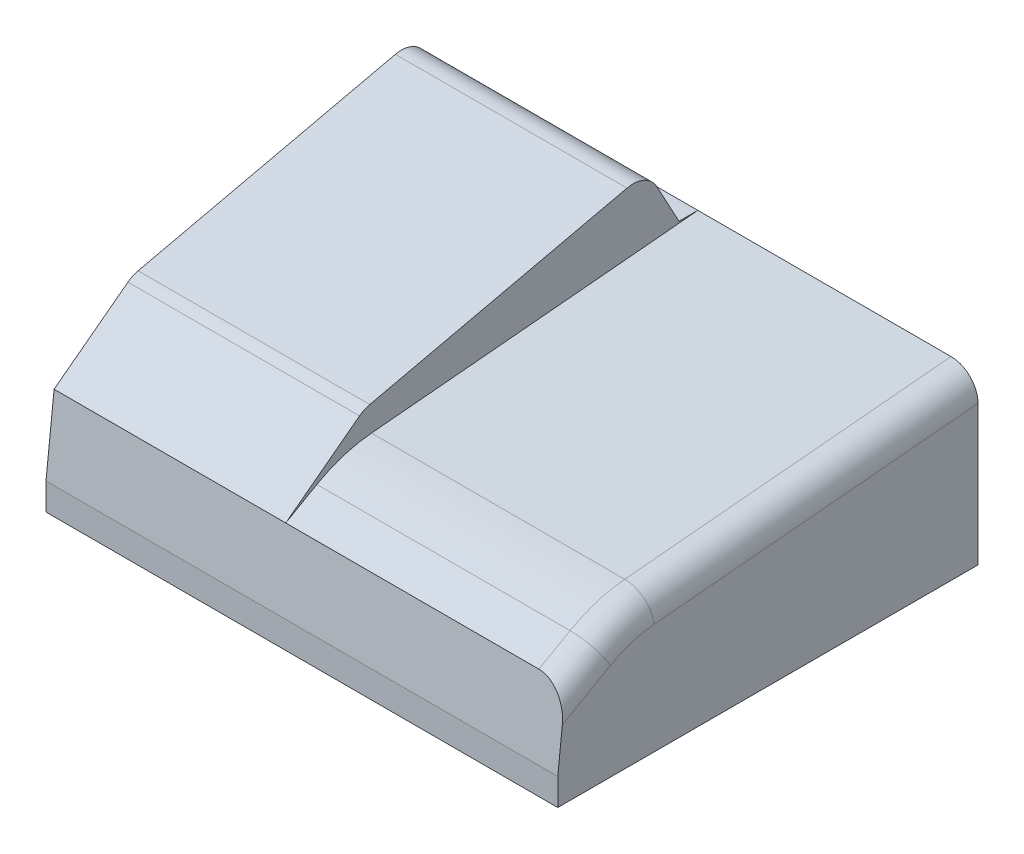
ISO-10303-21;
HEADER;
FILE_DESCRIPTION(('STEP AP214'),'2;1');
FILE_NAME('part.step','',(''),(''),'','','');
FILE_SCHEMA(('AUTOMOTIVE_DESIGN { 1 0 10303 214 1 1 1 1 }'));
ENDSEC;
DATA;
#1=APPLICATION_CONTEXT('core data for automotive mechanical design processes');
#2=APPLICATION_PROTOCOL_DEFINITION('international standard','automotive_design',2000,#1);
#3=PRODUCT_CONTEXT('',#1,'mechanical');
#4=PRODUCT('Part','Part','',(#3));
#5=PRODUCT_RELATED_PRODUCT_CATEGORY('part','',(#4));
#6=PRODUCT_DEFINITION_FORMATION('','',#4);
#7=PRODUCT_DEFINITION_CONTEXT('part definition',#1,'design');
#8=PRODUCT_DEFINITION('design','',#6,#7);
#9=PRODUCT_DEFINITION_SHAPE('','',#8);
#10=(LENGTH_UNIT() NAMED_UNIT(*) SI_UNIT(.MILLI.,.METRE.));
#11=(NAMED_UNIT(*) PLANE_ANGLE_UNIT() SI_UNIT($,.RADIAN.));
#12=(NAMED_UNIT(*) SI_UNIT($,.STERADIAN.) SOLID_ANGLE_UNIT());
#13=UNCERTAINTY_MEASURE_WITH_UNIT(LENGTH_MEASURE(1.E-05),#10,'distance_accuracy_value','');
#14=(GEOMETRIC_REPRESENTATION_CONTEXT(3) GLOBAL_UNCERTAINTY_ASSIGNED_CONTEXT((#13)) GLOBAL_UNIT_ASSIGNED_CONTEXT((#10,
#11,#12)) REPRESENTATION_CONTEXT('',''));
#15=CARTESIAN_POINT('',(0.,0.,0.));
#16=DIRECTION('',(0.,0.,1.));
#17=DIRECTION('',(1.,0.,0.));
#18=AXIS2_PLACEMENT_3D('',#15,#16,#17);
#19=CARTESIAN_POINT('',(95.,84.,78.));
#20=DIRECTION('',(-1.,0.,0.));
#21=DIRECTION('',(0.,0.,1.));
#22=AXIS2_PLACEMENT_3D('',#19,#20,#21);
#23=PLANE('',#22);
#24=CARTESIAN_POINT('',(95.,1.19028875614798,38.6387728230092));
#25=DIRECTION('',(-1.,0.,0.));
#26=DIRECTION('',(0.,0.,1.));
#27=AXIS2_PLACEMENT_3D('',#24,#25,#26);
#28=CIRCLE('',#27,40.);
#29=CARTESIAN_POINT('',(95.,41.0260170148562,42.2602026647099));
#30=VERTEX_POINT('',#29);
#31=CARTESIAN_POINT('',(95.,35.9200144411263,58.4843303572825));
#32=VERTEX_POINT('',#31);
#33=EDGE_CURVE('E277',#30,#32,#28,.F.);
#34=ORIENTED_EDGE('',*,*,#33,.T.);
#35=DIRECTION('',(0.,-0.496138938356834,0.868243142124459));
#36=VECTOR('',#35,1.);
#37=CARTESIAN_POINT('',(95.,29.3175685787554,70.0386106164317));
#38=LINE('',#37,#36);
#39=CARTESIAN_POINT('',(95.,25.7313469047631,76.3144985459183));
#40=VERTEX_POINT('',#39);
#41=EDGE_CURVE('E280',#32,#40,#38,.T.);
#42=ORIENTED_EDGE('',*,*,#41,.T.);
#43=DIRECTION('',(0.,-0.994309153919809,0.106533123634265));
#44=VECTOR('',#43,1.);
#45=CARTESIAN_POINT('',(95.,8.37578814627996,78.1740226986129));
#46=LINE('',#45,#44);
#47=CARTESIAN_POINT('',(95.,10.,78.));
#48=VERTEX_POINT('',#47);
#49=EDGE_CURVE('E334',#40,#48,#46,.T.);
#50=ORIENTED_EDGE('',*,*,#49,.T.);
#51=DIRECTION('',(0.,-1.,0.));
#52=VECTOR('',#51,1.);
#53=CARTESIAN_POINT('',(95.,84.,78.));
#54=LINE('',#53,#52);
#55=CARTESIAN_POINT('',(95.,0.,78.));
#56=VERTEX_POINT('',#55);
#57=EDGE_CURVE('E242',#48,#56,#54,.T.);
#58=ORIENTED_EDGE('',*,*,#57,.T.);
#59=DIRECTION('',(0.,0.,-1.));
#60=VECTOR('',#59,1.);
#61=CARTESIAN_POINT('',(95.,0.,78.));
#62=LINE('',#61,#60);
#63=CARTESIAN_POINT('',(95.,0.,-78.));
#64=VERTEX_POINT('',#63);
#65=EDGE_CURVE('E193',#56,#64,#62,.T.);
#66=ORIENTED_EDGE('',*,*,#65,.T.);
#67=DIRECTION('',(0.,-1.,0.));
#68=VECTOR('',#67,1.);
#69=CARTESIAN_POINT('',(95.,84.,-78.));
#70=LINE('',#69,#68);
#71=CARTESIAN_POINT('',(95.,51.958762711648,-78.));
#72=VERTEX_POINT('',#71);
#73=EDGE_CURVE('E250',#72,#64,#70,.T.);
#74=ORIENTED_EDGE('',*,*,#73,.F.);
#75=DIRECTION('',(0.,-0.0905357460425184,0.995893206467704));
#76=VECTOR('',#75,1.);
#77=CARTESIAN_POINT('',(95.,41.0260170148562,42.2602026647099));
#78=LINE('',#77,#76);
#79=EDGE_CURVE('E274',#72,#30,#78,.T.);
#80=ORIENTED_EDGE('',*,*,#79,.T.);
#81=EDGE_LOOP('',(#34,#42,#50,#58,#66,#74,#80));
#82=FACE_BOUND('',#81,.T.);
#83=ADVANCED_FACE('F71',(#82),#23,.F.);
#84=CARTESIAN_POINT('',(95.,62.,0.));
#85=DIRECTION('',(0.,-1.,0.));
#86=DIRECTION('',(0.,0.,-1.));
#87=AXIS2_PLACEMENT_3D('',#84,#85,#86);
#88=PLANE('',#87);
#89=DIRECTION('',(0.,0.,1.));
#90=VECTOR('',#89,1.);
#91=CARTESIAN_POINT('',(-9.00000000000001,62.,0.));
#92=LINE('',#91,#90);
#93=CARTESIAN_POINT('',(-9.00000000000001,62.,-78.));
#94=VERTEX_POINT('',#93);
#95=CARTESIAN_POINT('',(-9.00000000000001,62.,-71.));
#96=VERTEX_POINT('',#95);
#97=EDGE_CURVE('E200',#94,#96,#92,.T.);
#98=ORIENTED_EDGE('',*,*,#97,.F.);
#99=DIRECTION('',(-1.,0.,0.));
#100=VECTOR('',#99,1.);
#101=CARTESIAN_POINT('',(95.,62.,-78.));
#102=LINE('',#101,#100);
#103=CARTESIAN_POINT('',(-95.,62.,-78.));
#104=VERTEX_POINT('',#103);
#105=EDGE_CURVE('E194',#94,#104,#102,.T.);
#106=ORIENTED_EDGE('',*,*,#105,.T.);
#107=DIRECTION('',(0.,0.,1.));
#108=VECTOR('',#107,1.);
#109=CARTESIAN_POINT('',(-95.,62.,0.));
#110=LINE('',#109,#108);
#111=CARTESIAN_POINT('',(-95.,62.,-71.));
#112=VERTEX_POINT('',#111);
#113=EDGE_CURVE('E350',#104,#112,#110,.T.);
#114=ORIENTED_EDGE('',*,*,#113,.T.);
#115=DIRECTION('',(-1.,0.,0.));
#116=VECTOR('',#115,1.);
#117=CARTESIAN_POINT('',(95.,62.,-71.));
#118=LINE('',#117,#116);
#119=EDGE_CURVE('E213',#96,#112,#118,.T.);
#120=ORIENTED_EDGE('',*,*,#119,.F.);
#121=EDGE_LOOP('',(#98,#106,#114,#120));
#122=FACE_BOUND('',#121,.T.);
#123=ADVANCED_FACE('F210',(#122),#88,.F.);
#124=CARTESIAN_POINT('',(95.,43.6861619273724,-80.8906520723429));
#125=DIRECTION('',(0.,-0.475192789399669,0.879881703925341));
#126=DIRECTION('',(0.,-0.879881703925341,-0.475192789399669));
#127=AXIS2_PLACEMENT_3D('',#124,#125,#126);
#128=PLANE('',#127);
#129=DIRECTION('',(0.,0.879881703925341,0.475192789399669));
#130=VECTOR('',#129,1.);
#131=CARTESIAN_POINT('',(-95.,43.6861619273724,-80.8906520723429));
#132=LINE('',#131,#130);
#133=CARTESIAN_POINT('',(-95.,77.3088485792152,-62.7322357921518));
#134=VERTEX_POINT('',#133);
#135=EDGE_CURVE('E223',#112,#134,#132,.T.);
#136=ORIENTED_EDGE('',*,*,#135,.T.);
#137=DIRECTION('',(-1.,0.,0.));
#138=VECTOR('',#137,1.);
#139=CARTESIAN_POINT('',(95.,77.3088485792151,-62.7322357921518));
#140=LINE('',#139,#138);
#141=CARTESIAN_POINT('',(-9.00000000000001,77.3088485792152,-62.7322357921518));
#142=VERTEX_POINT('',#141);
#143=EDGE_CURVE('E268',#134,#142,#140,.F.);
#144=ORIENTED_EDGE('',*,*,#143,.T.);
#145=DIRECTION('',(0.,0.879881703925341,0.475192789399669));
#146=VECTOR('',#145,1.);
#147=CARTESIAN_POINT('',(-9.00000000000001,43.6861619273724,-80.8906520723429));
#148=LINE('',#147,#146);
#149=EDGE_CURVE('E215',#96,#142,#148,.T.);
#150=ORIENTED_EDGE('',*,*,#149,.F.);
#151=ORIENTED_EDGE('',*,*,#119,.T.);
#152=EDGE_LOOP('',(#136,#144,#150,#151));
#153=FACE_BOUND('',#152,.T.);
#154=ADVANCED_FACE('F360',(#153),#128,.F.);
#155=CARTESIAN_POINT('',(95.,60.264316280733,45.5315753052334));
#156=DIRECTION('',(0.,-0.797876644434083,-0.602820753015859));
#157=DIRECTION('',(0.,0.602820753015859,-0.797876644434083));
#158=AXIS2_PLACEMENT_3D('',#155,#156,#157);
#159=PLANE('',#158);
#160=DIRECTION('',(0.,-0.602820753015859,0.797876644434083));
#161=VECTOR('',#160,1.);
#162=CARTESIAN_POINT('',(-9.00000000000001,60.264316280733,45.5315753052334));
#163=LINE('',#162,#161);
#164=CARTESIAN_POINT('',(-9.00000000000001,58.7078191262554,47.5917112917149));
#165=VERTEX_POINT('',#164);
#166=CARTESIAN_POINT('',(-9.00000000000001,38.,75.));
#167=VERTEX_POINT('',#166);
#168=EDGE_CURVE('E330',#165,#167,#163,.T.);
#169=ORIENTED_EDGE('',*,*,#168,.F.);
#170=DIRECTION('',(-1.,0.,0.));
#171=VECTOR('',#170,1.);
#172=CARTESIAN_POINT('',(95.,58.7078191262553,47.5917112917149));
#173=LINE('',#172,#171);
#174=CARTESIAN_POINT('',(-95.,58.7078191262553,47.5917112917149));
#175=VERTEX_POINT('',#174);
#176=EDGE_CURVE('E298',#165,#175,#173,.T.);
#177=ORIENTED_EDGE('',*,*,#176,.T.);
#178=DIRECTION('',(0.,-0.60282075301586,0.797876644434083));
#179=VECTOR('',#178,1.);
#180=CARTESIAN_POINT('',(-95.,60.264316280733,45.5315753052334));
#181=LINE('',#180,#179);
#182=CARTESIAN_POINT('',(-95.,38.,75.));
#183=VERTEX_POINT('',#182);
#184=EDGE_CURVE('E333',#175,#183,#181,.T.);
#185=ORIENTED_EDGE('',*,*,#184,.T.);
#186=DIRECTION('',(-1.,0.,0.));
#187=VECTOR('',#186,1.);
#188=CARTESIAN_POINT('',(95.,38.,75.));
#189=LINE('',#188,#187);
#190=EDGE_CURVE('E337',#167,#183,#189,.T.);
#191=ORIENTED_EDGE('',*,*,#190,.F.);
#192=EDGE_LOOP('',(#169,#177,#185,#191));
#193=FACE_BOUND('',#192,.T.);
#194=ADVANCED_FACE('F424',(#193),#159,.F.);
#195=CARTESIAN_POINT('',(95.,66.9874295875038,15.3114124771437));
#196=DIRECTION('',(0.,-0.974858506571867,-0.222824801502141));
#197=DIRECTION('',(0.,0.222824801502141,-0.974858506571867));
#198=AXIS2_PLACEMENT_3D('',#195,#196,#197);
#199=PLANE('',#198);
#200=DIRECTION('',(0.,-0.222824801502141,0.974858506571867));
#201=VECTOR('',#200,1.);
#202=CARTESIAN_POINT('',(-95.,66.9874295875038,15.3114124771437));
#203=LINE('',#202,#201);
#204=CARTESIAN_POINT('',(-95.,82.3055057509371,-51.705170737877));
#205=VERTEX_POINT('',#204);
#206=CARTESIAN_POINT('',(-95.,60.4776377476332,43.7917517765777));
#207=VERTEX_POINT('',#206);
#208=EDGE_CURVE('E338',#205,#207,#203,.T.);
#209=ORIENTED_EDGE('',*,*,#208,.T.);
#210=DIRECTION('',(-1.,0.,0.));
#211=VECTOR('',#210,1.);
#212=CARTESIAN_POINT('',(95.,60.4776377476332,43.7917517765777));
#213=LINE('',#212,#211);
#214=CARTESIAN_POINT('',(-9.00000000000001,60.4776377476332,43.7917517765777));
#215=VERTEX_POINT('',#214);
#216=EDGE_CURVE('E81',#207,#215,#213,.F.);
#217=ORIENTED_EDGE('',*,*,#216,.T.);
#218=DIRECTION('',(0.,-0.222824801502141,0.974858506571867));
#219=VECTOR('',#218,1.);
#220=CARTESIAN_POINT('',(-9.00000000000001,66.9874295875038,15.3114124771437));
#221=LINE('',#220,#219);
#222=CARTESIAN_POINT('',(-9.00000000000001,82.3055057509371,-51.705170737877));
#223=VERTEX_POINT('',#222);
#224=EDGE_CURVE('E327',#223,#215,#221,.T.);
#225=ORIENTED_EDGE('',*,*,#224,.F.);
#226=DIRECTION('',(-1.,0.,0.));
#227=VECTOR('',#226,1.);
#228=CARTESIAN_POINT('',(95.,82.3055057509371,-51.705170737877));
#229=LINE('',#228,#227);
#230=EDGE_CURVE('E261',#223,#205,#229,.T.);
#231=ORIENTED_EDGE('',*,*,#230,.T.);
#232=EDGE_LOOP('',(#209,#217,#225,#231));
#233=FACE_BOUND('',#232,.T.);
#234=ADVANCED_FACE('F366',(#233),#199,.F.);
#235=CARTESIAN_POINT('',(-95.,84.,-78.));
#236=DIRECTION('',(0.,0.,1.));
#237=DIRECTION('',(1.,0.,0.));
#238=AXIS2_PLACEMENT_3D('',#235,#236,#237);
#239=PLANE('',#238);
#240=CARTESIAN_POINT('',(85.,62.,-78.));
#241=VERTEX_POINT('',#240);
#242=EDGE_CURVE('E181',#241,#94,#102,.T.);
#243=ORIENTED_EDGE('',*,*,#242,.F.);
#244=CARTESIAN_POINT('',(85.,51.9587627116479,-78.));
#245=DIRECTION('',(0.,0.,1.));
#246=DIRECTION('',(0.,1.,0.));
#247=AXIS2_PLACEMENT_3D('',#244,#245,#246);
#248=ELLIPSE('',#247,10.0412372883521,10.);
#249=EDGE_CURVE('E295',#241,#72,#248,.F.);
#250=ORIENTED_EDGE('',*,*,#249,.T.);
#251=ORIENTED_EDGE('',*,*,#73,.T.);
#252=DIRECTION('',(-1.,0.,0.));
#253=VECTOR('',#252,1.);
#254=CARTESIAN_POINT('',(-95.,0.,-78.));
#255=LINE('',#254,#253);
#256=CARTESIAN_POINT('',(-95.,0.,-78.));
#257=VERTEX_POINT('',#256);
#258=EDGE_CURVE('E231',#64,#257,#255,.T.);
#259=ORIENTED_EDGE('',*,*,#258,.T.);
#260=DIRECTION('',(0.,-1.,0.));
#261=VECTOR('',#260,1.);
#262=CARTESIAN_POINT('',(-95.,84.,-78.));
#263=LINE('',#262,#261);
#264=EDGE_CURVE('E220',#104,#257,#263,.T.);
#265=ORIENTED_EDGE('',*,*,#264,.F.);
#266=ORIENTED_EDGE('',*,*,#105,.F.);
#267=EDGE_LOOP('',(#243,#250,#251,#259,#265,#266));
#268=FACE_BOUND('',#267,.T.);
#269=ADVANCED_FACE('F218',(#268),#239,.F.);
#270=CARTESIAN_POINT('',(-95.,84.,78.));
#271=DIRECTION('',(1.,0.,0.));
#272=DIRECTION('',(0.,0.,-1.));
#273=AXIS2_PLACEMENT_3D('',#270,#271,#272);
#274=PLANE('',#273);
#275=ORIENTED_EDGE('',*,*,#184,.F.);
#276=CARTESIAN_POINT('',(-95.,50.7290526819145,41.5635037615563));
#277=DIRECTION('',(1.,0.,0.));
#278=DIRECTION('',(0.,0.,-1.));
#279=AXIS2_PLACEMENT_3D('',#276,#277,#278);
#280=CIRCLE('',#279,10.);
#281=EDGE_CURVE('E96',#175,#207,#280,.F.);
#282=ORIENTED_EDGE('',*,*,#281,.T.);
#283=ORIENTED_EDGE('',*,*,#208,.F.);
#284=CARTESIAN_POINT('',(-95.,72.5569206852184,-53.9334187528984));
#285=DIRECTION('',(1.,0.,0.));
#286=DIRECTION('',(0.,0.,-1.));
#287=AXIS2_PLACEMENT_3D('',#284,#285,#286);
#288=CIRCLE('',#287,10.);
#289=EDGE_CURVE('E265',#205,#134,#288,.F.);
#290=ORIENTED_EDGE('',*,*,#289,.T.);
#291=ORIENTED_EDGE('',*,*,#135,.F.);
#292=ORIENTED_EDGE('',*,*,#113,.F.);
#293=ORIENTED_EDGE('',*,*,#264,.T.);
#294=DIRECTION('',(0.,0.,1.));
#295=VECTOR('',#294,1.);
#296=CARTESIAN_POINT('',(-95.,0.,78.));
#297=LINE('',#296,#295);
#298=CARTESIAN_POINT('',(-95.,0.,78.));
#299=VERTEX_POINT('',#298);
#300=EDGE_CURVE('E234',#257,#299,#297,.T.);
#301=ORIENTED_EDGE('',*,*,#300,.T.);
#302=DIRECTION('',(0.,-1.,0.));
#303=VECTOR('',#302,1.);
#304=CARTESIAN_POINT('',(-95.,84.,78.));
#305=LINE('',#304,#303);
#306=CARTESIAN_POINT('',(-95.,10.,78.));
#307=VERTEX_POINT('',#306);
#308=EDGE_CURVE('E245',#307,#299,#305,.T.);
#309=ORIENTED_EDGE('',*,*,#308,.F.);
#310=DIRECTION('',(0.,-0.994309153919809,0.106533123634265));
#311=VECTOR('',#310,1.);
#312=CARTESIAN_POINT('',(-95.,8.37578814627996,78.1740226986129));
#313=LINE('',#312,#311);
#314=EDGE_CURVE('E341',#183,#307,#313,.T.);
#315=ORIENTED_EDGE('',*,*,#314,.F.);
#316=EDGE_LOOP('',(#275,#282,#283,#290,#291,#292,#293,#301,#309,#315));
#317=FACE_BOUND('',#316,.T.);
#318=ADVANCED_FACE('F367',(#317),#274,.F.);
#319=CARTESIAN_POINT('',(-95.,84.,78.));
#320=DIRECTION('',(0.,0.,-1.));
#321=DIRECTION('',(-1.,0.,0.));
#322=AXIS2_PLACEMENT_3D('',#319,#320,#321);
#323=PLANE('',#322);
#324=ORIENTED_EDGE('',*,*,#57,.F.);
#325=DIRECTION('',(-1.,0.,0.));
#326=VECTOR('',#325,1.);
#327=CARTESIAN_POINT('',(95.,10.,78.));
#328=LINE('',#327,#326);
#329=EDGE_CURVE('E346',#48,#307,#328,.T.);
#330=ORIENTED_EDGE('',*,*,#329,.T.);
#331=ORIENTED_EDGE('',*,*,#308,.T.);
#332=DIRECTION('',(1.,0.,0.));
#333=VECTOR('',#332,1.);
#334=CARTESIAN_POINT('',(-95.,0.,78.));
#335=LINE('',#334,#333);
#336=EDGE_CURVE('E238',#299,#56,#335,.T.);
#337=ORIENTED_EDGE('',*,*,#336,.T.);
#338=EDGE_LOOP('',(#324,#330,#331,#337));
#339=FACE_BOUND('',#338,.T.);
#340=ADVANCED_FACE('F370',(#339),#323,.F.);
#341=CARTESIAN_POINT('',(0.,0.,0.));
#342=DIRECTION('',(0.,-1.,0.));
#343=DIRECTION('',(0.,0.,-1.));
#344=AXIS2_PLACEMENT_3D('',#341,#342,#343);
#345=PLANE('',#344);
#346=ORIENTED_EDGE('',*,*,#65,.F.);
#347=ORIENTED_EDGE('',*,*,#336,.F.);
#348=ORIENTED_EDGE('',*,*,#300,.F.);
#349=ORIENTED_EDGE('',*,*,#258,.F.);
#350=EDGE_LOOP('',(#346,#347,#348,#349));
#351=FACE_BOUND('',#350,.T.);
#352=ADVANCED_FACE('F377',(#351),#345,.T.);
#353=CARTESIAN_POINT('',(95.,8.37578814627996,78.1740226986129));
#354=DIRECTION('',(0.,-0.106533123634265,-0.994309153919809));
#355=DIRECTION('',(0.,0.994309153919809,-0.106533123634265));
#356=AXIS2_PLACEMENT_3D('',#353,#354,#355);
#357=PLANE('',#356);
#358=ORIENTED_EDGE('',*,*,#49,.F.);
#359=CARTESIAN_POINT('',(85.,25.7313469047631,76.3144985459183));
#360=DIRECTION('',(0.,-0.106533123634265,-0.994309153919809));
#361=DIRECTION('',(0.,0.994309153919809,-0.106533123634265));
#362=AXIS2_PLACEMENT_3D('',#359,#360,#361);
#363=ELLIPSE('',#362,12.33887171497,10.);
#364=CARTESIAN_POINT('',(85.,38.,75.));
#365=VERTEX_POINT('',#364);
#366=EDGE_CURVE('E284',#40,#365,#363,.F.);
#367=ORIENTED_EDGE('',*,*,#366,.T.);
#368=EDGE_CURVE('E351',#365,#167,#189,.T.);
#369=ORIENTED_EDGE('',*,*,#368,.T.);
#370=ORIENTED_EDGE('',*,*,#190,.T.);
#371=ORIENTED_EDGE('',*,*,#314,.T.);
#372=ORIENTED_EDGE('',*,*,#329,.F.);
#373=EDGE_LOOP('',(#358,#367,#369,#370,#371,#372));
#374=FACE_BOUND('',#373,.T.);
#375=ADVANCED_FACE('F419',(#374),#357,.F.);
#376=CARTESIAN_POINT('',(-9.00000000000001,60.9538461538462,34.8307692307692));
#377=DIRECTION('',(0.,0.868243142124459,0.496138938356834));
#378=DIRECTION('',(0.,-0.496138938356834,0.868243142124459));
#379=AXIS2_PLACEMENT_3D('',#376,#377,#378);
#380=PLANE('',#379);
#381=ORIENTED_EDGE('',*,*,#368,.F.);
#382=DIRECTION('',(0.,-0.496138938356834,0.868243142124459));
#383=VECTOR('',#382,1.);
#384=CARTESIAN_POINT('',(85.,44.6024458623709,63.4457197408509));
#385=LINE('',#384,#383);
#386=CARTESIAN_POINT('',(85.,44.6024458623709,63.4457197408509));
#387=VERTEX_POINT('',#386);
#388=EDGE_CURVE('E287',#365,#387,#385,.F.);
#389=ORIENTED_EDGE('',*,*,#388,.T.);
#390=DIRECTION('',(1.,0.,0.));
#391=VECTOR('',#390,1.);
#392=CARTESIAN_POINT('',(-9.00000000000001,44.6024458623709,63.4457197408509));
#393=LINE('',#392,#391);
#394=CARTESIAN_POINT('',(-9.00000000000001,44.6024458623709,63.4457197408509));
#395=VERTEX_POINT('',#394);
#396=EDGE_CURVE('E256',#387,#395,#393,.F.);
#397=ORIENTED_EDGE('',*,*,#396,.T.);
#398=DIRECTION('',(0.,-0.496138938356834,0.868243142124459));
#399=VECTOR('',#398,1.);
#400=CARTESIAN_POINT('',(-9.00000000000001,60.9538461538462,34.8307692307692));
#401=LINE('',#400,#399);
#402=EDGE_CURVE('E206',#395,#167,#401,.T.);
#403=ORIENTED_EDGE('',*,*,#402,.T.);
#404=EDGE_LOOP('',(#381,#389,#397,#403));
#405=FACE_BOUND('',#404,.T.);
#406=ADVANCED_FACE('F428',(#405),#380,.T.);
#407=CARTESIAN_POINT('',(-9.00000000000001,54.4590163934426,4.95081967213114));
#408=DIRECTION('',(0.,0.995893206467704,0.0905357460425184));
#409=DIRECTION('',(0.,-0.0905357460425184,0.995893206467704));
#410=AXIS2_PLACEMENT_3D('',#407,#408,#409);
#411=PLANE('',#410);
#412=DIRECTION('',(1.,0.,0.));
#413=VECTOR('',#412,1.);
#414=CARTESIAN_POINT('',(-9.00000000000001,50.9849490795332,43.1655601251351));
#415=LINE('',#414,#413);
#416=CARTESIAN_POINT('',(-9.00000000000001,50.9849490795332,43.1655601251351));
#417=VERTEX_POINT('',#416);
#418=CARTESIAN_POINT('',(85.,50.9849490795332,43.1655601251351));
#419=VERTEX_POINT('',#418);
#420=EDGE_CURVE('E253',#417,#419,#415,.T.);
#421=ORIENTED_EDGE('',*,*,#420,.T.);
#422=DIRECTION('',(0.,-0.0905357460425184,0.995893206467704));
#423=VECTOR('',#422,1.);
#424=CARTESIAN_POINT('',(85.,62.,-78.));
#425=LINE('',#424,#423);
#426=EDGE_CURVE('E188',#419,#241,#425,.F.);
#427=ORIENTED_EDGE('',*,*,#426,.T.);
#428=ORIENTED_EDGE('',*,*,#242,.T.);
#429=DIRECTION('',(0.,-0.0905357460425184,0.995893206467704));
#430=VECTOR('',#429,1.);
#431=CARTESIAN_POINT('',(-9.00000000000001,54.4590163934426,4.95081967213114));
#432=LINE('',#431,#430);
#433=EDGE_CURVE('E185',#94,#417,#432,.T.);
#434=ORIENTED_EDGE('',*,*,#433,.T.);
#435=EDGE_LOOP('',(#421,#427,#428,#434));
#436=FACE_BOUND('',#435,.T.);
#437=ADVANCED_FACE('F184',(#436),#411,.T.);
#438=CARTESIAN_POINT('',(-9.00000000000001,0.,0.));
#439=DIRECTION('',(1.,0.,0.));
#440=DIRECTION('',(0.,0.,-1.));
#441=AXIS2_PLACEMENT_3D('',#438,#439,#440);
#442=PLANE('',#441);
#443=ORIENTED_EDGE('',*,*,#224,.T.);
#444=CARTESIAN_POINT('',(-9.00000000000001,50.7290526819145,41.5635037615563));
#445=DIRECTION('',(1.,0.,0.));
#446=DIRECTION('',(0.,0.,-1.));
#447=AXIS2_PLACEMENT_3D('',#444,#445,#446);
#448=CIRCLE('',#447,10.);
#449=EDGE_CURVE('E12',#215,#165,#448,.T.);
#450=ORIENTED_EDGE('',*,*,#449,.T.);
#451=ORIENTED_EDGE('',*,*,#168,.T.);
#452=ORIENTED_EDGE('',*,*,#402,.F.);
#453=CARTESIAN_POINT('',(-9.00000000000001,1.19028875614798,38.6387728230092));
#454=DIRECTION('',(1.,0.,0.));
#455=DIRECTION('',(0.,0.,-1.));
#456=AXIS2_PLACEMENT_3D('',#453,#454,#455);
#457=CIRCLE('',#456,50.);
#458=EDGE_CURVE('E204',#395,#417,#457,.F.);
#459=ORIENTED_EDGE('',*,*,#458,.T.);
#460=ORIENTED_EDGE('',*,*,#433,.F.);
#461=ORIENTED_EDGE('',*,*,#97,.T.);
#462=ORIENTED_EDGE('',*,*,#149,.T.);
#463=CARTESIAN_POINT('',(-9.00000000000001,72.5569206852184,-53.9334187528984));
#464=DIRECTION('',(1.,0.,0.));
#465=DIRECTION('',(0.,0.,-1.));
#466=AXIS2_PLACEMENT_3D('',#463,#464,#465);
#467=CIRCLE('',#466,10.);
#468=EDGE_CURVE('E271',#142,#223,#467,.T.);
#469=ORIENTED_EDGE('',*,*,#468,.T.);
#470=EDGE_LOOP('',(#443,#450,#451,#452,#459,#460,#461,#462,#469));
#471=FACE_BOUND('',#470,.T.);
#472=ADVANCED_FACE('F198',(#471),#442,.T.);
#473=CARTESIAN_POINT('',(-9.00000000000001,1.19028875614798,38.6387728230092));
#474=DIRECTION('',(1.,0.,0.));
#475=DIRECTION('',(0.,0.,-1.));
#476=AXIS2_PLACEMENT_3D('',#473,#474,#475);
#477=CYLINDRICAL_SURFACE('',#476,50.);
#478=ORIENTED_EDGE('',*,*,#396,.F.);
#479=CARTESIAN_POINT('',(85.,1.19028875614798,38.6387728230092));
#480=DIRECTION('',(-1.,0.,0.));
#481=DIRECTION('',(0.,0.,1.));
#482=AXIS2_PLACEMENT_3D('',#479,#480,#481);
#483=CIRCLE('',#482,50.);
#484=EDGE_CURVE('E290',#387,#419,#483,.T.);
#485=ORIENTED_EDGE('',*,*,#484,.T.);
#486=ORIENTED_EDGE('',*,*,#420,.F.);
#487=ORIENTED_EDGE('',*,*,#458,.F.);
#488=EDGE_LOOP('',(#478,#485,#486,#487));
#489=FACE_BOUND('',#488,.T.);
#490=ADVANCED_FACE('F391',(#489),#477,.T.);
#491=CARTESIAN_POINT('',(95.,72.5569206852184,-53.9334187528984));
#492=DIRECTION('',(-1.,0.,0.));
#493=DIRECTION('',(0.,0.,1.));
#494=AXIS2_PLACEMENT_3D('',#491,#492,#493);
#495=CYLINDRICAL_SURFACE('',#494,10.);
#496=ORIENTED_EDGE('',*,*,#468,.F.);
#497=ORIENTED_EDGE('',*,*,#143,.F.);
#498=ORIENTED_EDGE('',*,*,#289,.F.);
#499=ORIENTED_EDGE('',*,*,#230,.F.);
#500=EDGE_LOOP('',(#496,#497,#498,#499));
#501=FACE_BOUND('',#500,.T.);
#502=ADVANCED_FACE('F363',(#501),#495,.T.);
#503=CARTESIAN_POINT('',(85.,38.1558220336836,73.8323474576076));
#504=DIRECTION('',(0.,0.0905357460425184,-0.995893206467704));
#505=DIRECTION('',(0.,0.995893206467704,0.0905357460425184));
#506=AXIS2_PLACEMENT_3D('',#503,#504,#505);
#507=CYLINDRICAL_SURFACE('',#506,10.);
#508=ORIENTED_EDGE('',*,*,#249,.F.);
#509=ORIENTED_EDGE('',*,*,#426,.F.);
#510=CARTESIAN_POINT('',(85.,41.0260170148562,42.2602026647099));
#511=DIRECTION('',(0.,-0.0905357460425187,0.995893206467704));
#512=DIRECTION('',(0.,-0.995893206467704,-0.0905357460425187));
#513=AXIS2_PLACEMENT_3D('',#510,#511,#512);
#514=CIRCLE('',#513,10.);
#515=EDGE_CURVE('E75',#30,#419,#514,.T.);
#516=ORIENTED_EDGE('',*,*,#515,.F.);
#517=ORIENTED_EDGE('',*,*,#79,.F.);
#518=EDGE_LOOP('',(#508,#509,#516,#517));
#519=FACE_BOUND('',#518,.T.);
#520=ADVANCED_FACE('F397',(#519),#507,.T.);
#521=CARTESIAN_POINT('',(85.,1.19028875614798,38.6387728230092));
#522=DIRECTION('',(-1.,0.,0.));
#523=DIRECTION('',(0.,0.,1.));
#524=AXIS2_PLACEMENT_3D('',#521,#522,#523);
#525=TOROIDAL_SURFACE('',#524,40.,10.);
#526=ORIENTED_EDGE('',*,*,#515,.T.);
#527=ORIENTED_EDGE('',*,*,#484,.F.);
#528=CARTESIAN_POINT('',(85.,35.9200144411263,58.4843303572825));
#529=DIRECTION('',(0.,-0.496138938356834,0.868243142124459));
#530=DIRECTION('',(0.,-0.868243142124459,-0.496138938356835));
#531=AXIS2_PLACEMENT_3D('',#528,#529,#530);
#532=CIRCLE('',#531,10.);
#533=EDGE_CURVE('E305',#32,#387,#532,.T.);
#534=ORIENTED_EDGE('',*,*,#533,.F.);
#535=ORIENTED_EDGE('',*,*,#33,.F.);
#536=EDGE_LOOP('',(#526,#527,#534,#535));
#537=FACE_BOUND('',#536,.T.);
#538=ADVANCED_FACE('F401',(#537),#525,.T.);
#539=CARTESIAN_POINT('',(85.,39.3483378095246,52.4847644625855));
#540=DIRECTION('',(0.,0.496138938356834,-0.868243142124459));
#541=DIRECTION('',(0.,0.868243142124459,0.496138938356834));
#542=AXIS2_PLACEMENT_3D('',#539,#540,#541);
#543=CYLINDRICAL_SURFACE('',#542,10.);
#544=ORIENTED_EDGE('',*,*,#533,.T.);
#545=ORIENTED_EDGE('',*,*,#388,.F.);
#546=ORIENTED_EDGE('',*,*,#366,.F.);
#547=ORIENTED_EDGE('',*,*,#41,.F.);
#548=EDGE_LOOP('',(#544,#545,#546,#547));
#549=FACE_BOUND('',#548,.T.);
#550=ADVANCED_FACE('F398',(#549),#543,.T.);
#551=CARTESIAN_POINT('',(95.,50.7290526819145,41.5635037615563));
#552=DIRECTION('',(-1.,0.,0.));
#553=DIRECTION('',(0.,0.,1.));
#554=AXIS2_PLACEMENT_3D('',#551,#552,#553);
#555=CYLINDRICAL_SURFACE('',#554,10.);
#556=ORIENTED_EDGE('',*,*,#449,.F.);
#557=ORIENTED_EDGE('',*,*,#216,.F.);
#558=ORIENTED_EDGE('',*,*,#281,.F.);
#559=ORIENTED_EDGE('',*,*,#176,.F.);
#560=EDGE_LOOP('',(#556,#557,#558,#559));
#561=FACE_BOUND('',#560,.T.);
#562=ADVANCED_FACE('F73',(#561),#555,.T.);
#563=CLOSED_SHELL('',(#83,#123,#154,#194,#234,#269,#318,#340,#352,#375,#406,#437,#472,#490,#502,
#520,#538,#550,#562));
#564=MANIFOLD_SOLID_BREP('B2',#563);
#565=ADVANCED_BREP_SHAPE_REPRESENTATION('',(#18,#564),#14);
#566=SHAPE_DEFINITION_REPRESENTATION(#9,#565);
ENDSEC;
END-ISO-10303-21;
